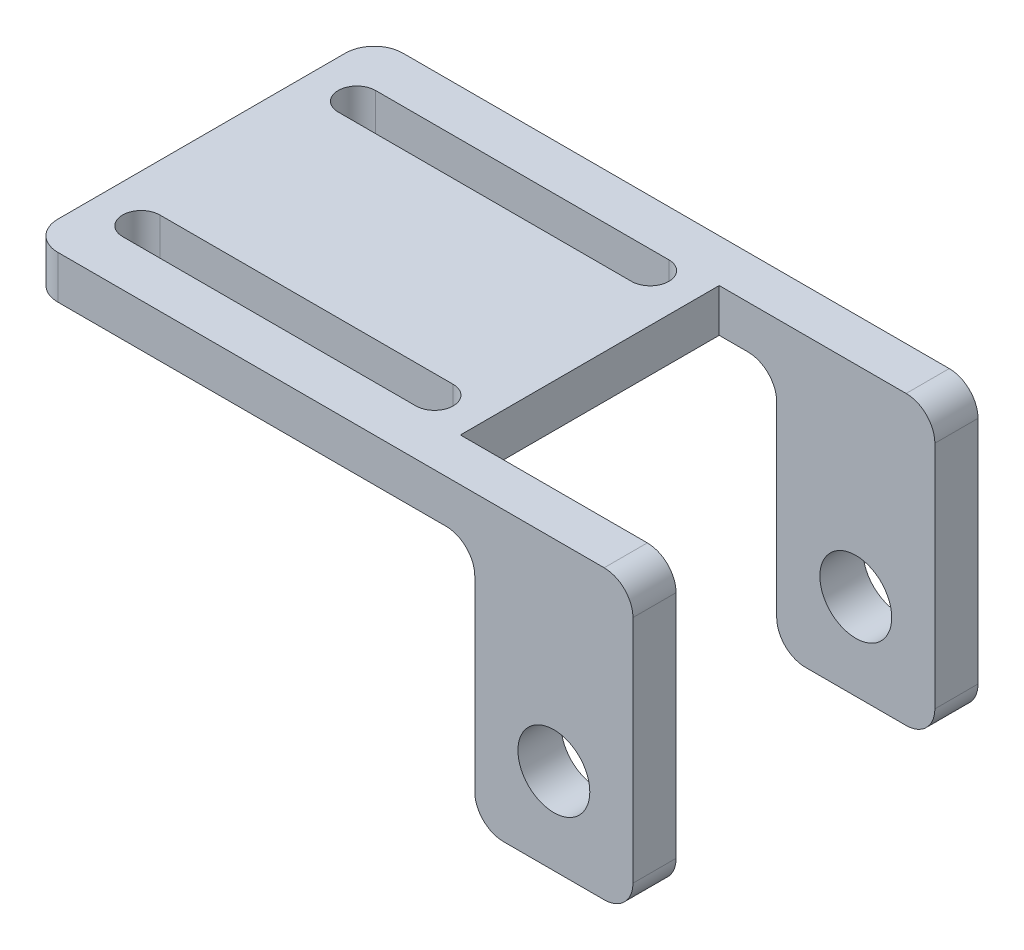
ISO-10303-21;
HEADER;
FILE_DESCRIPTION(('STEP AP214'),'2;1');
FILE_NAME('part.step','',(''),(''),'','','');
FILE_SCHEMA(('AUTOMOTIVE_DESIGN { 1 0 10303 214 1 1 1 1 }'));
ENDSEC;
DATA;
#1=APPLICATION_CONTEXT('core data for automotive mechanical design processes');
#2=APPLICATION_PROTOCOL_DEFINITION('international standard','automotive_design',2000,#1);
#3=PRODUCT_CONTEXT('',#1,'mechanical');
#4=PRODUCT('Part','Part','',(#3));
#5=PRODUCT_RELATED_PRODUCT_CATEGORY('part','',(#4));
#6=PRODUCT_DEFINITION_FORMATION('','',#4);
#7=PRODUCT_DEFINITION_CONTEXT('part definition',#1,'design');
#8=PRODUCT_DEFINITION('design','',#6,#7);
#9=PRODUCT_DEFINITION_SHAPE('','',#8);
#10=(LENGTH_UNIT() NAMED_UNIT(*) SI_UNIT(.MILLI.,.METRE.));
#11=(NAMED_UNIT(*) PLANE_ANGLE_UNIT() SI_UNIT($,.RADIAN.));
#12=(NAMED_UNIT(*) SI_UNIT($,.STERADIAN.) SOLID_ANGLE_UNIT());
#13=UNCERTAINTY_MEASURE_WITH_UNIT(LENGTH_MEASURE(1.E-05),#10,'distance_accuracy_value','');
#14=(GEOMETRIC_REPRESENTATION_CONTEXT(3) GLOBAL_UNCERTAINTY_ASSIGNED_CONTEXT((#13)) GLOBAL_UNIT_ASSIGNED_CONTEXT((#10,
#11,#12)) REPRESENTATION_CONTEXT('',''));
#15=CARTESIAN_POINT('',(0.,0.,0.));
#16=DIRECTION('',(0.,0.,1.));
#17=DIRECTION('',(1.,0.,0.));
#18=AXIS2_PLACEMENT_3D('',#15,#16,#17);
#19=CARTESIAN_POINT('',(42.,3.,0.));
#20=DIRECTION('',(-1.,0.,0.));
#21=DIRECTION('',(0.,0.,1.));
#22=AXIS2_PLACEMENT_3D('',#19,#20,#21);
#23=PLANE('',#22);
#24=DIRECTION('',(0.,1.,0.));
#25=VECTOR('',#24,1.);
#26=CARTESIAN_POINT('',(42.,-17.,-3.));
#27=LINE('',#26,#25);
#28=CARTESIAN_POINT('',(42.,-15.,-3.));
#29=VERTEX_POINT('',#28);
#30=CARTESIAN_POINT('',(42.,1.,-3.));
#31=VERTEX_POINT('',#30);
#32=EDGE_CURVE('E350',#29,#31,#27,.T.);
#33=ORIENTED_EDGE('',*,*,#32,.T.);
#34=DIRECTION('',(0.,0.,-1.));
#35=VECTOR('',#34,1.);
#36=CARTESIAN_POINT('',(42.,1.,0.));
#37=LINE('',#36,#35);
#38=CARTESIAN_POINT('',(42.,1.,0.));
#39=VERTEX_POINT('',#38);
#40=EDGE_CURVE('E433',#31,#39,#37,.F.);
#41=ORIENTED_EDGE('',*,*,#40,.T.);
#42=DIRECTION('',(0.,-1.,0.));
#43=VECTOR('',#42,1.);
#44=CARTESIAN_POINT('',(42.,3.,0.));
#45=LINE('',#44,#43);
#46=CARTESIAN_POINT('',(42.,-15.,0.));
#47=VERTEX_POINT('',#46);
#48=EDGE_CURVE('E378',#39,#47,#45,.T.);
#49=ORIENTED_EDGE('',*,*,#48,.T.);
#50=DIRECTION('',(0.,0.,1.));
#51=VECTOR('',#50,1.);
#52=CARTESIAN_POINT('',(42.,-15.,0.));
#53=LINE('',#52,#51);
#54=EDGE_CURVE('E431',#47,#29,#53,.F.);
#55=ORIENTED_EDGE('',*,*,#54,.T.);
#56=EDGE_LOOP('',(#33,#41,#49,#55));
#57=FACE_BOUND('',#56,.T.);
#58=ADVANCED_FACE('F38',(#57),#23,.F.);
#59=CARTESIAN_POINT('',(0.,0.,0.));
#60=DIRECTION('',(0.,-1.,0.));
#61=DIRECTION('',(0.,0.,-1.));
#62=AXIS2_PLACEMENT_3D('',#59,#60,#61);
#63=PLANE('',#62);
#64=CARTESIAN_POINT('',(3.29999999999999,0.,-19.5));
#65=DIRECTION('',(0.,-1.,0.));
#66=DIRECTION('',(0.,0.,-1.));
#67=AXIS2_PLACEMENT_3D('',#64,#65,#66);
#68=CIRCLE('',#67,1.3);
#69=CARTESIAN_POINT('',(3.29999999999999,0.,-18.2));
#70=VERTEX_POINT('',#69);
#71=CARTESIAN_POINT('',(3.29999999999999,0.,-20.8));
#72=VERTEX_POINT('',#71);
#73=EDGE_CURVE('E296',#70,#72,#68,.T.);
#74=ORIENTED_EDGE('',*,*,#73,.F.);
#75=DIRECTION('',(-1.,0.,0.));
#76=VECTOR('',#75,1.);
#77=CARTESIAN_POINT('',(0.,0.,-18.2));
#78=LINE('',#77,#76);
#79=CARTESIAN_POINT('',(23.7,0.,-18.2));
#80=VERTEX_POINT('',#79);
#81=EDGE_CURVE('E291',#80,#70,#78,.T.);
#82=ORIENTED_EDGE('',*,*,#81,.F.);
#83=CARTESIAN_POINT('',(23.7,0.,-19.5));
#84=DIRECTION('',(0.,-1.,0.));
#85=DIRECTION('',(0.,0.,-1.));
#86=AXIS2_PLACEMENT_3D('',#83,#84,#85);
#87=CIRCLE('',#86,1.29999999999999);
#88=CARTESIAN_POINT('',(23.7,0.,-20.8));
#89=VERTEX_POINT('',#88);
#90=EDGE_CURVE('E239',#89,#80,#87,.T.);
#91=ORIENTED_EDGE('',*,*,#90,.F.);
#92=DIRECTION('',(1.,0.,0.));
#93=VECTOR('',#92,1.);
#94=CARTESIAN_POINT('',(0.,0.,-20.8));
#95=LINE('',#94,#93);
#96=EDGE_CURVE('E294',#72,#89,#95,.T.);
#97=ORIENTED_EDGE('',*,*,#96,.F.);
#98=EDGE_LOOP('',(#74,#82,#91,#97));
#99=FACE_BOUND('',#98,.T.);
#100=CARTESIAN_POINT('',(3.3,0.,-4.5));
#101=DIRECTION('',(0.,-1.,0.));
#102=DIRECTION('',(0.,0.,-1.));
#103=AXIS2_PLACEMENT_3D('',#100,#101,#102);
#104=CIRCLE('',#103,1.3);
#105=CARTESIAN_POINT('',(3.3,0.,-3.2));
#106=VERTEX_POINT('',#105);
#107=CARTESIAN_POINT('',(3.3,0.,-5.8));
#108=VERTEX_POINT('',#107);
#109=EDGE_CURVE('E289',#106,#108,#104,.T.);
#110=ORIENTED_EDGE('',*,*,#109,.F.);
#111=DIRECTION('',(-1.,0.,0.));
#112=VECTOR('',#111,1.);
#113=CARTESIAN_POINT('',(0.,0.,-3.2));
#114=LINE('',#113,#112);
#115=CARTESIAN_POINT('',(23.7,0.,-3.2));
#116=VERTEX_POINT('',#115);
#117=EDGE_CURVE('E263',#116,#106,#114,.T.);
#118=ORIENTED_EDGE('',*,*,#117,.F.);
#119=CARTESIAN_POINT('',(23.7,0.,-4.5));
#120=DIRECTION('',(0.,-1.,0.));
#121=DIRECTION('',(0.,0.,-1.));
#122=AXIS2_PLACEMENT_3D('',#119,#120,#121);
#123=CIRCLE('',#122,1.3);
#124=CARTESIAN_POINT('',(23.7,0.,-5.8));
#125=VERTEX_POINT('',#124);
#126=EDGE_CURVE('E285',#125,#116,#123,.T.);
#127=ORIENTED_EDGE('',*,*,#126,.F.);
#128=DIRECTION('',(1.,0.,0.));
#129=VECTOR('',#128,1.);
#130=CARTESIAN_POINT('',(0.,0.,-5.8));
#131=LINE('',#130,#129);
#132=EDGE_CURVE('E287',#108,#125,#131,.T.);
#133=ORIENTED_EDGE('',*,*,#132,.F.);
#134=EDGE_LOOP('',(#110,#118,#127,#133));
#135=FACE_BOUND('',#134,.T.);
#136=DIRECTION('',(1.,0.,0.));
#137=VECTOR('',#136,1.);
#138=CARTESIAN_POINT('',(42.,0.,-3.));
#139=LINE('',#138,#137);
#140=CARTESIAN_POINT('',(27.,0.,-3.));
#141=VERTEX_POINT('',#140);
#142=CARTESIAN_POINT('',(29.,0.,-3.));
#143=VERTEX_POINT('',#142);
#144=EDGE_CURVE('E305',#141,#143,#139,.T.);
#145=ORIENTED_EDGE('',*,*,#144,.T.);
#146=DIRECTION('',(0.,0.,-1.));
#147=VECTOR('',#146,1.);
#148=CARTESIAN_POINT('',(29.,0.,0.));
#149=LINE('',#148,#147);
#150=CARTESIAN_POINT('',(29.,0.,0.));
#151=VERTEX_POINT('',#150);
#152=EDGE_CURVE('E462',#143,#151,#149,.F.);
#153=ORIENTED_EDGE('',*,*,#152,.T.);
#154=DIRECTION('',(1.,0.,0.));
#155=VECTOR('',#154,1.);
#156=CARTESIAN_POINT('',(0.,0.,0.));
#157=LINE('',#156,#155);
#158=CARTESIAN_POINT('',(2.,0.,0.));
#159=VERTEX_POINT('',#158);
#160=EDGE_CURVE('E372',#159,#151,#157,.T.);
#161=ORIENTED_EDGE('',*,*,#160,.F.);
#162=CARTESIAN_POINT('',(2.,0.,-2.));
#163=DIRECTION('',(0.,-1.,0.));
#164=DIRECTION('',(0.,0.,-1.));
#165=AXIS2_PLACEMENT_3D('',#162,#163,#164);
#166=CIRCLE('',#165,2.);
#167=CARTESIAN_POINT('',(0.,0.,-2.));
#168=VERTEX_POINT('',#167);
#169=EDGE_CURVE('E388',#159,#168,#166,.T.);
#170=ORIENTED_EDGE('',*,*,#169,.T.);
#171=DIRECTION('',(0.,0.,1.));
#172=VECTOR('',#171,1.);
#173=CARTESIAN_POINT('',(0.,0.,0.));
#174=LINE('',#173,#172);
#175=CARTESIAN_POINT('',(0.,0.,-22.));
#176=VERTEX_POINT('',#175);
#177=EDGE_CURVE('E359',#176,#168,#174,.T.);
#178=ORIENTED_EDGE('',*,*,#177,.F.);
#179=CARTESIAN_POINT('',(1.99999999999999,0.,-22.));
#180=DIRECTION('',(0.,-1.,0.));
#181=DIRECTION('',(0.,0.,-1.));
#182=AXIS2_PLACEMENT_3D('',#179,#180,#181);
#183=CIRCLE('',#182,2.);
#184=CARTESIAN_POINT('',(1.99999999999999,0.,-24.));
#185=VERTEX_POINT('',#184);
#186=EDGE_CURVE('E390',#176,#185,#183,.T.);
#187=ORIENTED_EDGE('',*,*,#186,.T.);
#188=DIRECTION('',(-1.,0.,0.));
#189=VECTOR('',#188,1.);
#190=CARTESIAN_POINT('',(0.,0.,-24.));
#191=LINE('',#190,#189);
#192=CARTESIAN_POINT('',(29.,0.,-24.));
#193=VERTEX_POINT('',#192);
#194=EDGE_CURVE('E364',#193,#185,#191,.T.);
#195=ORIENTED_EDGE('',*,*,#194,.F.);
#196=DIRECTION('',(0.,0.,-1.));
#197=VECTOR('',#196,1.);
#198=CARTESIAN_POINT('',(29.,0.,0.));
#199=LINE('',#198,#197);
#200=CARTESIAN_POINT('',(29.,0.,-21.));
#201=VERTEX_POINT('',#200);
#202=EDGE_CURVE('E460',#193,#201,#199,.F.);
#203=ORIENTED_EDGE('',*,*,#202,.T.);
#204=DIRECTION('',(-1.,0.,0.));
#205=VECTOR('',#204,1.);
#206=CARTESIAN_POINT('',(42.,0.,-21.));
#207=LINE('',#206,#205);
#208=CARTESIAN_POINT('',(27.,0.,-21.));
#209=VERTEX_POINT('',#208);
#210=EDGE_CURVE('E299',#201,#209,#207,.T.);
#211=ORIENTED_EDGE('',*,*,#210,.T.);
#212=DIRECTION('',(0.,0.,1.));
#213=VECTOR('',#212,1.);
#214=CARTESIAN_POINT('',(27.,0.,-21.));
#215=LINE('',#214,#213);
#216=EDGE_CURVE('E301',#209,#141,#215,.T.);
#217=ORIENTED_EDGE('',*,*,#216,.T.);
#218=EDGE_LOOP('',(#145,#153,#161,#170,#178,#187,#195,#203,#211,#217));
#219=FACE_BOUND('',#218,.T.);
#220=ADVANCED_FACE('F479',(#99,#135,#219),#63,.T.);
#221=CARTESIAN_POINT('',(0.,3.,0.));
#222=DIRECTION('',(1.,0.,0.));
#223=DIRECTION('',(0.,0.,-1.));
#224=AXIS2_PLACEMENT_3D('',#221,#222,#223);
#225=PLANE('',#224);
#226=DIRECTION('',(0.,0.,1.));
#227=VECTOR('',#226,1.);
#228=CARTESIAN_POINT('',(0.,3.,0.));
#229=LINE('',#228,#227);
#230=CARTESIAN_POINT('',(0.,3.,-22.));
#231=VERTEX_POINT('',#230);
#232=CARTESIAN_POINT('',(0.,3.,-2.));
#233=VERTEX_POINT('',#232);
#234=EDGE_CURVE('E360',#231,#233,#229,.T.);
#235=ORIENTED_EDGE('',*,*,#234,.F.);
#236=DIRECTION('',(0.,-1.,0.));
#237=VECTOR('',#236,1.);
#238=CARTESIAN_POINT('',(0.,3.,-22.));
#239=LINE('',#238,#237);
#240=EDGE_CURVE('E385',#231,#176,#239,.T.);
#241=ORIENTED_EDGE('',*,*,#240,.T.);
#242=ORIENTED_EDGE('',*,*,#177,.T.);
#243=DIRECTION('',(0.,-1.,0.));
#244=VECTOR('',#243,1.);
#245=CARTESIAN_POINT('',(0.,3.,-2.));
#246=LINE('',#245,#244);
#247=EDGE_CURVE('E381',#168,#233,#246,.F.);
#248=ORIENTED_EDGE('',*,*,#247,.T.);
#249=EDGE_LOOP('',(#235,#241,#242,#248));
#250=FACE_BOUND('',#249,.T.);
#251=ADVANCED_FACE('F564',(#250),#225,.F.);
#252=CARTESIAN_POINT('',(0.,3.,0.));
#253=DIRECTION('',(0.,0.,-1.));
#254=DIRECTION('',(-1.,0.,0.));
#255=AXIS2_PLACEMENT_3D('',#252,#253,#254);
#256=PLANE('',#255);
#257=CARTESIAN_POINT('',(36.5,-11.,0.));
#258=DIRECTION('',(0.,0.,1.));
#259=DIRECTION('',(1.,0.,0.));
#260=AXIS2_PLACEMENT_3D('',#257,#258,#259);
#261=CIRCLE('',#260,2.5);
#262=CARTESIAN_POINT('',(39.,-11.,0.));
#263=VERTEX_POINT('',#262);
#264=EDGE_CURVE('E317',#263,#263,#261,.T.);
#265=ORIENTED_EDGE('',*,*,#264,.F.);
#266=EDGE_LOOP('',(#265));
#267=FACE_BOUND('',#266,.T.);
#268=ORIENTED_EDGE('',*,*,#48,.F.);
#269=CARTESIAN_POINT('',(40.,1.,0.));
#270=DIRECTION('',(0.,0.,-1.));
#271=DIRECTION('',(-1.,0.,0.));
#272=AXIS2_PLACEMENT_3D('',#269,#270,#271);
#273=CIRCLE('',#272,2.);
#274=CARTESIAN_POINT('',(40.,3.,0.));
#275=VERTEX_POINT('',#274);
#276=EDGE_CURVE('E439',#39,#275,#273,.F.);
#277=ORIENTED_EDGE('',*,*,#276,.T.);
#278=DIRECTION('',(1.,0.,0.));
#279=VECTOR('',#278,1.);
#280=CARTESIAN_POINT('',(0.,3.,0.));
#281=LINE('',#280,#279);
#282=CARTESIAN_POINT('',(2.,3.,0.));
#283=VERTEX_POINT('',#282);
#284=EDGE_CURVE('E363',#283,#275,#281,.T.);
#285=ORIENTED_EDGE('',*,*,#284,.F.);
#286=DIRECTION('',(0.,-1.,0.));
#287=VECTOR('',#286,1.);
#288=CARTESIAN_POINT('',(2.,3.,0.));
#289=LINE('',#288,#287);
#290=EDGE_CURVE('E400',#283,#159,#289,.T.);
#291=ORIENTED_EDGE('',*,*,#290,.T.);
#292=ORIENTED_EDGE('',*,*,#160,.T.);
#293=CARTESIAN_POINT('',(29.,-2.,0.));
#294=DIRECTION('',(0.,0.,-1.));
#295=DIRECTION('',(-1.,0.,0.));
#296=AXIS2_PLACEMENT_3D('',#293,#294,#295);
#297=CIRCLE('',#296,2.);
#298=CARTESIAN_POINT('',(31.,-2.,0.));
#299=VERTEX_POINT('',#298);
#300=EDGE_CURVE('E469',#151,#299,#297,.T.);
#301=ORIENTED_EDGE('',*,*,#300,.T.);
#302=DIRECTION('',(0.,1.,0.));
#303=VECTOR('',#302,1.);
#304=CARTESIAN_POINT('',(31.,-17.,0.));
#305=LINE('',#304,#303);
#306=CARTESIAN_POINT('',(31.,-15.,0.));
#307=VERTEX_POINT('',#306);
#308=EDGE_CURVE('E356',#307,#299,#305,.T.);
#309=ORIENTED_EDGE('',*,*,#308,.F.);
#310=CARTESIAN_POINT('',(33.,-15.,0.));
#311=DIRECTION('',(0.,0.,-1.));
#312=DIRECTION('',(-1.,0.,0.));
#313=AXIS2_PLACEMENT_3D('',#310,#311,#312);
#314=CIRCLE('',#313,2.);
#315=CARTESIAN_POINT('',(33.,-17.,0.));
#316=VERTEX_POINT('',#315);
#317=EDGE_CURVE('E435',#307,#316,#314,.F.);
#318=ORIENTED_EDGE('',*,*,#317,.T.);
#319=DIRECTION('',(-1.,0.,0.));
#320=VECTOR('',#319,1.);
#321=CARTESIAN_POINT('',(42.,-17.,0.));
#322=LINE('',#321,#320);
#323=CARTESIAN_POINT('',(40.,-17.,0.));
#324=VERTEX_POINT('',#323);
#325=EDGE_CURVE('E344',#324,#316,#322,.T.);
#326=ORIENTED_EDGE('',*,*,#325,.F.);
#327=CARTESIAN_POINT('',(40.,-15.,0.));
#328=DIRECTION('',(0.,0.,-1.));
#329=DIRECTION('',(-1.,0.,0.));
#330=AXIS2_PLACEMENT_3D('',#327,#328,#329);
#331=CIRCLE('',#330,2.);
#332=EDGE_CURVE('E437',#324,#47,#331,.F.);
#333=ORIENTED_EDGE('',*,*,#332,.T.);
#334=EDGE_LOOP('',(#268,#277,#285,#291,#292,#301,#309,#318,#326,#333));
#335=FACE_BOUND('',#334,.T.);
#336=ADVANCED_FACE('F531',(#267,#335),#256,.F.);
#337=DIRECTION('',(0.,-1.,0.));
#338=VECTOR('',#337,1.);
#339=CARTESIAN_POINT('',(42.,3.,-24.));
#340=LINE('',#339,#338);
#341=CARTESIAN_POINT('',(42.,1.,-24.));
#342=VERTEX_POINT('',#341);
#343=CARTESIAN_POINT('',(42.,-15.,-24.));
#344=VERTEX_POINT('',#343);
#345=EDGE_CURVE('E369',#342,#344,#340,.T.);
#346=ORIENTED_EDGE('',*,*,#345,.F.);
#347=DIRECTION('',(0.,0.,-1.));
#348=VECTOR('',#347,1.);
#349=CARTESIAN_POINT('',(42.,1.,0.));
#350=LINE('',#349,#348);
#351=CARTESIAN_POINT('',(42.,1.,-21.));
#352=VERTEX_POINT('',#351);
#353=EDGE_CURVE('E417',#342,#352,#350,.F.);
#354=ORIENTED_EDGE('',*,*,#353,.T.);
#355=DIRECTION('',(0.,1.,0.));
#356=VECTOR('',#355,1.);
#357=CARTESIAN_POINT('',(42.,-17.,-21.));
#358=LINE('',#357,#356);
#359=CARTESIAN_POINT('',(42.,-15.,-21.));
#360=VERTEX_POINT('',#359);
#361=EDGE_CURVE('E341',#360,#352,#358,.T.);
#362=ORIENTED_EDGE('',*,*,#361,.F.);
#363=DIRECTION('',(0.,0.,1.));
#364=VECTOR('',#363,1.);
#365=CARTESIAN_POINT('',(42.,-15.,-24.));
#366=LINE('',#365,#364);
#367=EDGE_CURVE('E415',#360,#344,#366,.F.);
#368=ORIENTED_EDGE('',*,*,#367,.T.);
#369=EDGE_LOOP('',(#346,#354,#362,#368));
#370=FACE_BOUND('',#369,.T.);
#371=ADVANCED_FACE('F508',(#370),#23,.F.);
#372=CARTESIAN_POINT('',(0.,3.,-24.));
#373=DIRECTION('',(0.,0.,1.));
#374=DIRECTION('',(1.,0.,0.));
#375=AXIS2_PLACEMENT_3D('',#372,#373,#374);
#376=PLANE('',#375);
#377=CARTESIAN_POINT('',(36.5,-11.,-24.));
#378=DIRECTION('',(0.,0.,1.));
#379=DIRECTION('',(1.,0.,0.));
#380=AXIS2_PLACEMENT_3D('',#377,#378,#379);
#381=CIRCLE('',#380,2.5);
#382=CARTESIAN_POINT('',(39.,-11.,-24.));
#383=VERTEX_POINT('',#382);
#384=EDGE_CURVE('E320',#383,#383,#381,.T.);
#385=ORIENTED_EDGE('',*,*,#384,.T.);
#386=EDGE_LOOP('',(#385));
#387=FACE_BOUND('',#386,.T.);
#388=DIRECTION('',(-1.,0.,0.));
#389=VECTOR('',#388,1.);
#390=CARTESIAN_POINT('',(0.,3.,-24.));
#391=LINE('',#390,#389);
#392=CARTESIAN_POINT('',(40.,3.,-24.));
#393=VERTEX_POINT('',#392);
#394=CARTESIAN_POINT('',(1.99999999999999,3.,-24.));
#395=VERTEX_POINT('',#394);
#396=EDGE_CURVE('E367',#393,#395,#391,.T.);
#397=ORIENTED_EDGE('',*,*,#396,.F.);
#398=CARTESIAN_POINT('',(40.,1.,-24.));
#399=DIRECTION('',(0.,0.,1.));
#400=DIRECTION('',(1.,0.,0.));
#401=AXIS2_PLACEMENT_3D('',#398,#399,#400);
#402=CIRCLE('',#401,2.);
#403=EDGE_CURVE('E413',#393,#342,#402,.F.);
#404=ORIENTED_EDGE('',*,*,#403,.T.);
#405=ORIENTED_EDGE('',*,*,#345,.T.);
#406=CARTESIAN_POINT('',(40.,-15.,-24.));
#407=DIRECTION('',(0.,0.,1.));
#408=DIRECTION('',(1.,0.,0.));
#409=AXIS2_PLACEMENT_3D('',#406,#407,#408);
#410=CIRCLE('',#409,2.);
#411=CARTESIAN_POINT('',(40.,-17.,-24.));
#412=VERTEX_POINT('',#411);
#413=EDGE_CURVE('E411',#344,#412,#410,.F.);
#414=ORIENTED_EDGE('',*,*,#413,.T.);
#415=DIRECTION('',(1.,0.,0.));
#416=VECTOR('',#415,1.);
#417=CARTESIAN_POINT('',(42.,-17.,-24.));
#418=LINE('',#417,#416);
#419=CARTESIAN_POINT('',(33.,-17.,-24.));
#420=VERTEX_POINT('',#419);
#421=EDGE_CURVE('E332',#420,#412,#418,.T.);
#422=ORIENTED_EDGE('',*,*,#421,.F.);
#423=CARTESIAN_POINT('',(33.,-15.,-24.));
#424=DIRECTION('',(0.,0.,1.));
#425=DIRECTION('',(1.,0.,0.));
#426=AXIS2_PLACEMENT_3D('',#423,#424,#425);
#427=CIRCLE('',#426,2.);
#428=CARTESIAN_POINT('',(31.,-15.,-24.));
#429=VERTEX_POINT('',#428);
#430=EDGE_CURVE('E409',#420,#429,#427,.F.);
#431=ORIENTED_EDGE('',*,*,#430,.T.);
#432=DIRECTION('',(0.,1.,0.));
#433=VECTOR('',#432,1.);
#434=CARTESIAN_POINT('',(31.,-17.,-24.));
#435=LINE('',#434,#433);
#436=CARTESIAN_POINT('',(31.,-2.,-24.));
#437=VERTEX_POINT('',#436);
#438=EDGE_CURVE('E335',#429,#437,#435,.T.);
#439=ORIENTED_EDGE('',*,*,#438,.T.);
#440=CARTESIAN_POINT('',(29.,-2.,-24.));
#441=DIRECTION('',(0.,0.,1.));
#442=DIRECTION('',(1.,0.,0.));
#443=AXIS2_PLACEMENT_3D('',#440,#441,#442);
#444=CIRCLE('',#443,2.);
#445=EDGE_CURVE('E46',#437,#193,#444,.T.);
#446=ORIENTED_EDGE('',*,*,#445,.T.);
#447=ORIENTED_EDGE('',*,*,#194,.T.);
#448=DIRECTION('',(0.,-1.,0.));
#449=VECTOR('',#448,1.);
#450=CARTESIAN_POINT('',(1.99999999999999,3.,-24.));
#451=LINE('',#450,#449);
#452=EDGE_CURVE('E393',#185,#395,#451,.F.);
#453=ORIENTED_EDGE('',*,*,#452,.T.);
#454=EDGE_LOOP('',(#397,#404,#405,#414,#422,#431,#439,#446,#447,#453));
#455=FACE_BOUND('',#454,.T.);
#456=ADVANCED_FACE('F473',(#387,#455),#376,.F.);
#457=CARTESIAN_POINT('',(0.,3.,0.));
#458=DIRECTION('',(0.,-1.,0.));
#459=DIRECTION('',(0.,0.,-1.));
#460=AXIS2_PLACEMENT_3D('',#457,#458,#459);
#461=PLANE('',#460);
#462=DIRECTION('',(1.,0.,0.));
#463=VECTOR('',#462,1.);
#464=CARTESIAN_POINT('',(3.29999999999999,3.,-18.2));
#465=LINE('',#464,#463);
#466=CARTESIAN_POINT('',(3.29999999999999,3.,-18.2));
#467=VERTEX_POINT('',#466);
#468=CARTESIAN_POINT('',(23.7,3.,-18.2));
#469=VERTEX_POINT('',#468);
#470=EDGE_CURVE('E246',#467,#469,#465,.T.);
#471=ORIENTED_EDGE('',*,*,#470,.F.);
#472=CARTESIAN_POINT('',(3.29999999999999,3.,-19.5));
#473=DIRECTION('',(0.,1.,0.));
#474=DIRECTION('',(0.,0.,1.));
#475=AXIS2_PLACEMENT_3D('',#472,#473,#474);
#476=CIRCLE('',#475,1.3);
#477=CARTESIAN_POINT('',(3.29999999999999,3.,-20.8));
#478=VERTEX_POINT('',#477);
#479=EDGE_CURVE('E251',#478,#467,#476,.T.);
#480=ORIENTED_EDGE('',*,*,#479,.F.);
#481=DIRECTION('',(-1.,0.,0.));
#482=VECTOR('',#481,1.);
#483=CARTESIAN_POINT('',(3.29999999999999,3.,-20.8));
#484=LINE('',#483,#482);
#485=CARTESIAN_POINT('',(23.7,3.,-20.8));
#486=VERTEX_POINT('',#485);
#487=EDGE_CURVE('E256',#486,#478,#484,.T.);
#488=ORIENTED_EDGE('',*,*,#487,.F.);
#489=CARTESIAN_POINT('',(23.7,3.,-19.5));
#490=DIRECTION('',(0.,1.,0.));
#491=DIRECTION('',(0.,0.,1.));
#492=AXIS2_PLACEMENT_3D('',#489,#490,#491);
#493=CIRCLE('',#492,1.29999999999999);
#494=EDGE_CURVE('E236',#469,#486,#493,.T.);
#495=ORIENTED_EDGE('',*,*,#494,.F.);
#496=EDGE_LOOP('',(#471,#480,#488,#495));
#497=FACE_BOUND('',#496,.T.);
#498=DIRECTION('',(1.,0.,0.));
#499=VECTOR('',#498,1.);
#500=CARTESIAN_POINT('',(3.3,3.,-3.2));
#501=LINE('',#500,#499);
#502=CARTESIAN_POINT('',(3.3,3.,-3.2));
#503=VERTEX_POINT('',#502);
#504=CARTESIAN_POINT('',(23.7,3.,-3.2));
#505=VERTEX_POINT('',#504);
#506=EDGE_CURVE('E268',#503,#505,#501,.T.);
#507=ORIENTED_EDGE('',*,*,#506,.F.);
#508=CARTESIAN_POINT('',(3.3,3.,-4.5));
#509=DIRECTION('',(0.,1.,0.));
#510=DIRECTION('',(0.,0.,1.));
#511=AXIS2_PLACEMENT_3D('',#508,#509,#510);
#512=CIRCLE('',#511,1.3);
#513=CARTESIAN_POINT('',(3.3,3.,-5.8));
#514=VERTEX_POINT('',#513);
#515=EDGE_CURVE('E266',#514,#503,#512,.T.);
#516=ORIENTED_EDGE('',*,*,#515,.F.);
#517=DIRECTION('',(-1.,0.,0.));
#518=VECTOR('',#517,1.);
#519=CARTESIAN_POINT('',(3.3,3.,-5.8));
#520=LINE('',#519,#518);
#521=CARTESIAN_POINT('',(23.7,3.,-5.8));
#522=VERTEX_POINT('',#521);
#523=EDGE_CURVE('E273',#522,#514,#520,.T.);
#524=ORIENTED_EDGE('',*,*,#523,.F.);
#525=CARTESIAN_POINT('',(23.7,3.,-4.5));
#526=DIRECTION('',(0.,1.,0.));
#527=DIRECTION('',(0.,0.,1.));
#528=AXIS2_PLACEMENT_3D('',#525,#526,#527);
#529=CIRCLE('',#528,1.3);
#530=EDGE_CURVE('E270',#505,#522,#529,.T.);
#531=ORIENTED_EDGE('',*,*,#530,.F.);
#532=EDGE_LOOP('',(#507,#516,#524,#531));
#533=FACE_BOUND('',#532,.T.);
#534=DIRECTION('',(-1.,0.,0.));
#535=VECTOR('',#534,1.);
#536=CARTESIAN_POINT('',(42.,3.,-21.));
#537=LINE('',#536,#535);
#538=CARTESIAN_POINT('',(40.,3.,-21.));
#539=VERTEX_POINT('',#538);
#540=CARTESIAN_POINT('',(27.,3.,-21.));
#541=VERTEX_POINT('',#540);
#542=EDGE_CURVE('E298',#539,#541,#537,.T.);
#543=ORIENTED_EDGE('',*,*,#542,.F.);
#544=DIRECTION('',(0.,0.,-1.));
#545=VECTOR('',#544,1.);
#546=CARTESIAN_POINT('',(40.,3.,0.));
#547=LINE('',#546,#545);
#548=EDGE_CURVE('E406',#539,#393,#547,.T.);
#549=ORIENTED_EDGE('',*,*,#548,.T.);
#550=ORIENTED_EDGE('',*,*,#396,.T.);
#551=CARTESIAN_POINT('',(1.99999999999999,3.,-22.));
#552=DIRECTION('',(0.,-1.,0.));
#553=DIRECTION('',(0.,0.,-1.));
#554=AXIS2_PLACEMENT_3D('',#551,#552,#553);
#555=CIRCLE('',#554,2.);
#556=EDGE_CURVE('E398',#395,#231,#555,.F.);
#557=ORIENTED_EDGE('',*,*,#556,.T.);
#558=ORIENTED_EDGE('',*,*,#234,.T.);
#559=CARTESIAN_POINT('',(2.,3.,-2.));
#560=DIRECTION('',(0.,-1.,0.));
#561=DIRECTION('',(0.,0.,-1.));
#562=AXIS2_PLACEMENT_3D('',#559,#560,#561);
#563=CIRCLE('',#562,2.);
#564=EDGE_CURVE('E396',#233,#283,#563,.F.);
#565=ORIENTED_EDGE('',*,*,#564,.T.);
#566=ORIENTED_EDGE('',*,*,#284,.T.);
#567=DIRECTION('',(0.,0.,-1.));
#568=VECTOR('',#567,1.);
#569=CARTESIAN_POINT('',(40.,3.,0.));
#570=LINE('',#569,#568);
#571=CARTESIAN_POINT('',(40.,3.,-3.));
#572=VERTEX_POINT('',#571);
#573=EDGE_CURVE('E403',#275,#572,#570,.T.);
#574=ORIENTED_EDGE('',*,*,#573,.T.);
#575=DIRECTION('',(1.,0.,0.));
#576=VECTOR('',#575,1.);
#577=CARTESIAN_POINT('',(42.,3.,-3.));
#578=LINE('',#577,#576);
#579=CARTESIAN_POINT('',(27.,3.,-3.));
#580=VERTEX_POINT('',#579);
#581=EDGE_CURVE('E302',#580,#572,#578,.T.);
#582=ORIENTED_EDGE('',*,*,#581,.F.);
#583=DIRECTION('',(0.,0.,1.));
#584=VECTOR('',#583,1.);
#585=CARTESIAN_POINT('',(27.,3.,-21.));
#586=LINE('',#585,#584);
#587=EDGE_CURVE('E310',#541,#580,#586,.T.);
#588=ORIENTED_EDGE('',*,*,#587,.F.);
#589=EDGE_LOOP('',(#543,#549,#550,#557,#558,#565,#566,#574,#582,#588));
#590=FACE_BOUND('',#589,.T.);
#591=ADVANCED_FACE('F253',(#497,#533,#590),#461,.F.);
#592=CARTESIAN_POINT('',(31.,-17.,0.));
#593=DIRECTION('',(1.,0.,0.));
#594=DIRECTION('',(0.,0.,-1.));
#595=AXIS2_PLACEMENT_3D('',#592,#593,#594);
#596=PLANE('',#595);
#597=ORIENTED_EDGE('',*,*,#308,.T.);
#598=DIRECTION('',(0.,0.,-1.));
#599=VECTOR('',#598,1.);
#600=CARTESIAN_POINT('',(31.,-2.,0.));
#601=LINE('',#600,#599);
#602=CARTESIAN_POINT('',(31.,-2.,-3.));
#603=VERTEX_POINT('',#602);
#604=EDGE_CURVE('E457',#299,#603,#601,.T.);
#605=ORIENTED_EDGE('',*,*,#604,.T.);
#606=DIRECTION('',(0.,1.,0.));
#607=VECTOR('',#606,1.);
#608=CARTESIAN_POINT('',(31.,-17.,-3.));
#609=LINE('',#608,#607);
#610=CARTESIAN_POINT('',(31.,-15.,-3.));
#611=VERTEX_POINT('',#610);
#612=EDGE_CURVE('E353',#611,#603,#609,.T.);
#613=ORIENTED_EDGE('',*,*,#612,.F.);
#614=DIRECTION('',(0.,0.,-1.));
#615=VECTOR('',#614,1.);
#616=CARTESIAN_POINT('',(31.,-15.,0.));
#617=LINE('',#616,#615);
#618=EDGE_CURVE('E455',#611,#307,#617,.F.);
#619=ORIENTED_EDGE('',*,*,#618,.T.);
#620=EDGE_LOOP('',(#597,#605,#613,#619));
#621=FACE_BOUND('',#620,.T.);
#622=ADVANCED_FACE('F534',(#621),#596,.F.);
#623=CARTESIAN_POINT('',(42.,-17.,-3.));
#624=DIRECTION('',(0.,0.,1.));
#625=DIRECTION('',(1.,0.,0.));
#626=AXIS2_PLACEMENT_3D('',#623,#624,#625);
#627=PLANE('',#626);
#628=CARTESIAN_POINT('',(36.5,-11.,-3.));
#629=DIRECTION('',(0.,0.,1.));
#630=DIRECTION('',(1.,0.,0.));
#631=AXIS2_PLACEMENT_3D('',#628,#629,#630);
#632=CIRCLE('',#631,2.5);
#633=CARTESIAN_POINT('',(39.,-11.,-3.));
#634=VERTEX_POINT('',#633);
#635=EDGE_CURVE('E326',#634,#634,#632,.T.);
#636=ORIENTED_EDGE('',*,*,#635,.T.);
#637=EDGE_LOOP('',(#636));
#638=FACE_BOUND('',#637,.T.);
#639=ORIENTED_EDGE('',*,*,#581,.T.);
#640=CARTESIAN_POINT('',(40.,1.,-3.));
#641=DIRECTION('',(0.,0.,1.));
#642=DIRECTION('',(1.,0.,0.));
#643=AXIS2_PLACEMENT_3D('',#640,#641,#642);
#644=CIRCLE('',#643,2.);
#645=EDGE_CURVE('E429',#572,#31,#644,.F.);
#646=ORIENTED_EDGE('',*,*,#645,.T.);
#647=ORIENTED_EDGE('',*,*,#32,.F.);
#648=CARTESIAN_POINT('',(40.,-15.,-3.));
#649=DIRECTION('',(0.,0.,1.));
#650=DIRECTION('',(1.,0.,0.));
#651=AXIS2_PLACEMENT_3D('',#648,#649,#650);
#652=CIRCLE('',#651,2.);
#653=CARTESIAN_POINT('',(40.,-17.,-3.));
#654=VERTEX_POINT('',#653);
#655=EDGE_CURVE('E427',#29,#654,#652,.F.);
#656=ORIENTED_EDGE('',*,*,#655,.T.);
#657=DIRECTION('',(1.,0.,0.));
#658=VECTOR('',#657,1.);
#659=CARTESIAN_POINT('',(42.,-17.,-3.));
#660=LINE('',#659,#658);
#661=CARTESIAN_POINT('',(33.,-17.,-3.));
#662=VERTEX_POINT('',#661);
#663=EDGE_CURVE('E347',#662,#654,#660,.T.);
#664=ORIENTED_EDGE('',*,*,#663,.F.);
#665=CARTESIAN_POINT('',(33.,-15.,-3.));
#666=DIRECTION('',(0.,0.,1.));
#667=DIRECTION('',(1.,0.,0.));
#668=AXIS2_PLACEMENT_3D('',#665,#666,#667);
#669=CIRCLE('',#668,2.);
#670=EDGE_CURVE('E425',#662,#611,#669,.F.);
#671=ORIENTED_EDGE('',*,*,#670,.T.);
#672=ORIENTED_EDGE('',*,*,#612,.T.);
#673=CARTESIAN_POINT('',(29.,-2.,-3.));
#674=DIRECTION('',(0.,0.,1.));
#675=DIRECTION('',(1.,0.,0.));
#676=AXIS2_PLACEMENT_3D('',#673,#674,#675);
#677=CIRCLE('',#676,2.);
#678=EDGE_CURVE('E467',#603,#143,#677,.T.);
#679=ORIENTED_EDGE('',*,*,#678,.T.);
#680=ORIENTED_EDGE('',*,*,#144,.F.);
#681=DIRECTION('',(0.,1.,0.));
#682=VECTOR('',#681,1.);
#683=CARTESIAN_POINT('',(27.,0.,-3.));
#684=LINE('',#683,#682);
#685=EDGE_CURVE('E315',#141,#580,#684,.T.);
#686=ORIENTED_EDGE('',*,*,#685,.T.);
#687=EDGE_LOOP('',(#639,#646,#647,#656,#664,#671,#672,#679,#680,#686));
#688=FACE_BOUND('',#687,.T.);
#689=ADVANCED_FACE('F606',(#638,#688),#627,.F.);
#690=CARTESIAN_POINT('',(0.,-17.,0.));
#691=DIRECTION('',(0.,1.,0.));
#692=DIRECTION('',(0.,0.,1.));
#693=AXIS2_PLACEMENT_3D('',#690,#691,#692);
#694=PLANE('',#693);
#695=ORIENTED_EDGE('',*,*,#663,.T.);
#696=DIRECTION('',(0.,0.,1.));
#697=VECTOR('',#696,1.);
#698=CARTESIAN_POINT('',(40.,-17.,0.));
#699=LINE('',#698,#697);
#700=EDGE_CURVE('E450',#654,#324,#699,.T.);
#701=ORIENTED_EDGE('',*,*,#700,.T.);
#702=ORIENTED_EDGE('',*,*,#325,.T.);
#703=DIRECTION('',(0.,0.,-1.));
#704=VECTOR('',#703,1.);
#705=CARTESIAN_POINT('',(33.,-17.,0.));
#706=LINE('',#705,#704);
#707=EDGE_CURVE('E447',#316,#662,#706,.T.);
#708=ORIENTED_EDGE('',*,*,#707,.T.);
#709=EDGE_LOOP('',(#695,#701,#702,#708));
#710=FACE_BOUND('',#709,.T.);
#711=ADVANCED_FACE('F542',(#710),#694,.F.);
#712=CARTESIAN_POINT('',(42.,-17.,-21.));
#713=DIRECTION('',(0.,0.,-1.));
#714=DIRECTION('',(-1.,0.,0.));
#715=AXIS2_PLACEMENT_3D('',#712,#713,#714);
#716=PLANE('',#715);
#717=CARTESIAN_POINT('',(36.5,-11.,-21.));
#718=DIRECTION('',(0.,0.,-1.));
#719=DIRECTION('',(-1.,0.,0.));
#720=AXIS2_PLACEMENT_3D('',#717,#718,#719);
#721=CIRCLE('',#720,2.5);
#722=CARTESIAN_POINT('',(34.,-11.,-21.));
#723=VERTEX_POINT('',#722);
#724=EDGE_CURVE('E323',#723,#723,#721,.T.);
#725=ORIENTED_EDGE('',*,*,#724,.T.);
#726=EDGE_LOOP('',(#725));
#727=FACE_BOUND('',#726,.T.);
#728=ORIENTED_EDGE('',*,*,#361,.T.);
#729=CARTESIAN_POINT('',(40.,1.,-21.));
#730=DIRECTION('',(0.,0.,-1.));
#731=DIRECTION('',(-1.,0.,0.));
#732=AXIS2_PLACEMENT_3D('',#729,#730,#731);
#733=CIRCLE('',#732,2.);
#734=EDGE_CURVE('E423',#352,#539,#733,.F.);
#735=ORIENTED_EDGE('',*,*,#734,.T.);
#736=ORIENTED_EDGE('',*,*,#542,.T.);
#737=DIRECTION('',(0.,1.,0.));
#738=VECTOR('',#737,1.);
#739=CARTESIAN_POINT('',(27.,0.,-21.));
#740=LINE('',#739,#738);
#741=EDGE_CURVE('E308',#209,#541,#740,.T.);
#742=ORIENTED_EDGE('',*,*,#741,.F.);
#743=ORIENTED_EDGE('',*,*,#210,.F.);
#744=CARTESIAN_POINT('',(29.,-2.,-21.));
#745=DIRECTION('',(0.,0.,-1.));
#746=DIRECTION('',(-1.,0.,0.));
#747=AXIS2_PLACEMENT_3D('',#744,#745,#746);
#748=CIRCLE('',#747,2.);
#749=CARTESIAN_POINT('',(31.,-2.,-21.));
#750=VERTEX_POINT('',#749);
#751=EDGE_CURVE('E11',#201,#750,#748,.T.);
#752=ORIENTED_EDGE('',*,*,#751,.T.);
#753=DIRECTION('',(0.,1.,0.));
#754=VECTOR('',#753,1.);
#755=CARTESIAN_POINT('',(31.,-17.,-21.));
#756=LINE('',#755,#754);
#757=CARTESIAN_POINT('',(31.,-15.,-21.));
#758=VERTEX_POINT('',#757);
#759=EDGE_CURVE('E338',#758,#750,#756,.T.);
#760=ORIENTED_EDGE('',*,*,#759,.F.);
#761=CARTESIAN_POINT('',(33.,-15.,-21.));
#762=DIRECTION('',(0.,0.,-1.));
#763=DIRECTION('',(-1.,0.,0.));
#764=AXIS2_PLACEMENT_3D('',#761,#762,#763);
#765=CIRCLE('',#764,2.);
#766=CARTESIAN_POINT('',(33.,-17.,-21.));
#767=VERTEX_POINT('',#766);
#768=EDGE_CURVE('E419',#758,#767,#765,.F.);
#769=ORIENTED_EDGE('',*,*,#768,.T.);
#770=DIRECTION('',(-1.,0.,0.));
#771=VECTOR('',#770,1.);
#772=CARTESIAN_POINT('',(42.,-17.,-21.));
#773=LINE('',#772,#771);
#774=CARTESIAN_POINT('',(40.,-17.,-21.));
#775=VERTEX_POINT('',#774);
#776=EDGE_CURVE('E329',#775,#767,#773,.T.);
#777=ORIENTED_EDGE('',*,*,#776,.F.);
#778=CARTESIAN_POINT('',(40.,-15.,-21.));
#779=DIRECTION('',(0.,0.,-1.));
#780=DIRECTION('',(-1.,0.,0.));
#781=AXIS2_PLACEMENT_3D('',#778,#779,#780);
#782=CIRCLE('',#781,2.);
#783=EDGE_CURVE('E421',#775,#360,#782,.F.);
#784=ORIENTED_EDGE('',*,*,#783,.T.);
#785=EDGE_LOOP('',(#728,#735,#736,#742,#743,#752,#760,#769,#777,#784));
#786=FACE_BOUND('',#785,.T.);
#787=ADVANCED_FACE('F486',(#727,#786),#716,.F.);
#788=CARTESIAN_POINT('',(31.,-17.,-24.));
#789=DIRECTION('',(1.,0.,0.));
#790=DIRECTION('',(0.,0.,-1.));
#791=AXIS2_PLACEMENT_3D('',#788,#789,#790);
#792=PLANE('',#791);
#793=ORIENTED_EDGE('',*,*,#759,.T.);
#794=DIRECTION('',(0.,0.,-1.));
#795=VECTOR('',#794,1.);
#796=CARTESIAN_POINT('',(31.,-2.,-24.));
#797=LINE('',#796,#795);
#798=EDGE_CURVE('E464',#750,#437,#797,.T.);
#799=ORIENTED_EDGE('',*,*,#798,.T.);
#800=ORIENTED_EDGE('',*,*,#438,.F.);
#801=DIRECTION('',(0.,0.,-1.));
#802=VECTOR('',#801,1.);
#803=CARTESIAN_POINT('',(31.,-15.,-21.));
#804=LINE('',#803,#802);
#805=EDGE_CURVE('E453',#429,#758,#804,.F.);
#806=ORIENTED_EDGE('',*,*,#805,.T.);
#807=EDGE_LOOP('',(#793,#799,#800,#806));
#808=FACE_BOUND('',#807,.T.);
#809=ADVANCED_FACE('F490',(#808),#792,.F.);
#810=CARTESIAN_POINT('',(0.,-17.,0.));
#811=DIRECTION('',(0.,-1.,0.));
#812=DIRECTION('',(0.,0.,-1.));
#813=AXIS2_PLACEMENT_3D('',#810,#811,#812);
#814=PLANE('',#813);
#815=ORIENTED_EDGE('',*,*,#421,.T.);
#816=DIRECTION('',(0.,0.,1.));
#817=VECTOR('',#816,1.);
#818=CARTESIAN_POINT('',(40.,-17.,-21.));
#819=LINE('',#818,#817);
#820=EDGE_CURVE('E444',#412,#775,#819,.T.);
#821=ORIENTED_EDGE('',*,*,#820,.T.);
#822=ORIENTED_EDGE('',*,*,#776,.T.);
#823=DIRECTION('',(0.,0.,-1.));
#824=VECTOR('',#823,1.);
#825=CARTESIAN_POINT('',(33.,-17.,-24.));
#826=LINE('',#825,#824);
#827=EDGE_CURVE('E441',#767,#420,#826,.T.);
#828=ORIENTED_EDGE('',*,*,#827,.T.);
#829=EDGE_LOOP('',(#815,#821,#822,#828));
#830=FACE_BOUND('',#829,.T.);
#831=ADVANCED_FACE('F497',(#830),#814,.T.);
#832=CARTESIAN_POINT('',(36.5,-11.,-24.));
#833=DIRECTION('',(0.,0.,1.));
#834=DIRECTION('',(1.,0.,0.));
#835=AXIS2_PLACEMENT_3D('',#832,#833,#834);
#836=CYLINDRICAL_SURFACE('',#835,2.5);
#837=ORIENTED_EDGE('',*,*,#384,.F.);
#838=EDGE_LOOP('',(#837));
#839=FACE_BOUND('',#838,.T.);
#840=ORIENTED_EDGE('',*,*,#724,.F.);
#841=EDGE_LOOP('',(#840));
#842=FACE_BOUND('',#841,.T.);
#843=ADVANCED_FACE('F602',(#839,#842),#836,.F.);
#844=ORIENTED_EDGE('',*,*,#264,.T.);
#845=EDGE_LOOP('',(#844));
#846=FACE_BOUND('',#845,.T.);
#847=ORIENTED_EDGE('',*,*,#635,.F.);
#848=EDGE_LOOP('',(#847));
#849=FACE_BOUND('',#848,.T.);
#850=ADVANCED_FACE('F576',(#846,#849),#836,.F.);
#851=CARTESIAN_POINT('',(27.,0.,-21.));
#852=DIRECTION('',(-1.,0.,0.));
#853=DIRECTION('',(0.,0.,1.));
#854=AXIS2_PLACEMENT_3D('',#851,#852,#853);
#855=PLANE('',#854);
#856=ORIENTED_EDGE('',*,*,#587,.T.);
#857=ORIENTED_EDGE('',*,*,#685,.F.);
#858=ORIENTED_EDGE('',*,*,#216,.F.);
#859=ORIENTED_EDGE('',*,*,#741,.T.);
#860=EDGE_LOOP('',(#856,#857,#858,#859));
#861=FACE_BOUND('',#860,.T.);
#862=ADVANCED_FACE('F518',(#861),#855,.F.);
#863=CARTESIAN_POINT('',(1.99999999999999,3.,-22.));
#864=DIRECTION('',(0.,-1.,0.));
#865=DIRECTION('',(0.,0.,-1.));
#866=AXIS2_PLACEMENT_3D('',#863,#864,#865);
#867=CYLINDRICAL_SURFACE('',#866,2.);
#868=ORIENTED_EDGE('',*,*,#556,.F.);
#869=ORIENTED_EDGE('',*,*,#452,.F.);
#870=ORIENTED_EDGE('',*,*,#186,.F.);
#871=ORIENTED_EDGE('',*,*,#240,.F.);
#872=EDGE_LOOP('',(#868,#869,#870,#871));
#873=FACE_BOUND('',#872,.T.);
#874=ADVANCED_FACE('F568',(#873),#867,.T.);
#875=CARTESIAN_POINT('',(2.,3.,-2.));
#876=DIRECTION('',(0.,-1.,0.));
#877=DIRECTION('',(0.,0.,-1.));
#878=AXIS2_PLACEMENT_3D('',#875,#876,#877);
#879=CYLINDRICAL_SURFACE('',#878,2.);
#880=ORIENTED_EDGE('',*,*,#564,.F.);
#881=ORIENTED_EDGE('',*,*,#247,.F.);
#882=ORIENTED_EDGE('',*,*,#169,.F.);
#883=ORIENTED_EDGE('',*,*,#290,.F.);
#884=EDGE_LOOP('',(#880,#881,#882,#883));
#885=FACE_BOUND('',#884,.T.);
#886=ADVANCED_FACE('F562',(#885),#879,.T.);
#887=CARTESIAN_POINT('',(40.,1.,0.));
#888=DIRECTION('',(0.,0.,-1.));
#889=DIRECTION('',(-1.,0.,0.));
#890=AXIS2_PLACEMENT_3D('',#887,#888,#889);
#891=CYLINDRICAL_SURFACE('',#890,2.);
#892=ORIENTED_EDGE('',*,*,#734,.F.);
#893=ORIENTED_EDGE('',*,*,#353,.F.);
#894=ORIENTED_EDGE('',*,*,#403,.F.);
#895=ORIENTED_EDGE('',*,*,#548,.F.);
#896=EDGE_LOOP('',(#892,#893,#894,#895));
#897=FACE_BOUND('',#896,.T.);
#898=ADVANCED_FACE('F511',(#897),#891,.T.);
#899=CARTESIAN_POINT('',(40.,1.,0.));
#900=DIRECTION('',(0.,0.,-1.));
#901=DIRECTION('',(-1.,0.,0.));
#902=AXIS2_PLACEMENT_3D('',#899,#900,#901);
#903=CYLINDRICAL_SURFACE('',#902,2.);
#904=ORIENTED_EDGE('',*,*,#276,.F.);
#905=ORIENTED_EDGE('',*,*,#40,.F.);
#906=ORIENTED_EDGE('',*,*,#645,.F.);
#907=ORIENTED_EDGE('',*,*,#573,.F.);
#908=EDGE_LOOP('',(#904,#905,#906,#907));
#909=FACE_BOUND('',#908,.T.);
#910=ADVANCED_FACE('F554',(#909),#903,.T.);
#911=CARTESIAN_POINT('',(40.,-15.,0.));
#912=DIRECTION('',(0.,0.,-1.));
#913=DIRECTION('',(-1.,0.,0.));
#914=AXIS2_PLACEMENT_3D('',#911,#912,#913);
#915=CYLINDRICAL_SURFACE('',#914,2.);
#916=ORIENTED_EDGE('',*,*,#413,.F.);
#917=ORIENTED_EDGE('',*,*,#367,.F.);
#918=ORIENTED_EDGE('',*,*,#783,.F.);
#919=ORIENTED_EDGE('',*,*,#820,.F.);
#920=EDGE_LOOP('',(#916,#917,#918,#919));
#921=FACE_BOUND('',#920,.T.);
#922=ADVANCED_FACE('F502',(#921),#915,.T.);
#923=CARTESIAN_POINT('',(40.,-15.,0.));
#924=DIRECTION('',(0.,0.,1.));
#925=DIRECTION('',(1.,0.,0.));
#926=AXIS2_PLACEMENT_3D('',#923,#924,#925);
#927=CYLINDRICAL_SURFACE('',#926,2.);
#928=ORIENTED_EDGE('',*,*,#655,.F.);
#929=ORIENTED_EDGE('',*,*,#54,.F.);
#930=ORIENTED_EDGE('',*,*,#332,.F.);
#931=ORIENTED_EDGE('',*,*,#700,.F.);
#932=EDGE_LOOP('',(#928,#929,#930,#931));
#933=FACE_BOUND('',#932,.T.);
#934=ADVANCED_FACE('F547',(#933),#927,.T.);
#935=CARTESIAN_POINT('',(33.,-15.,0.));
#936=DIRECTION('',(0.,0.,1.));
#937=DIRECTION('',(1.,0.,0.));
#938=AXIS2_PLACEMENT_3D('',#935,#936,#937);
#939=CYLINDRICAL_SURFACE('',#938,2.);
#940=ORIENTED_EDGE('',*,*,#768,.F.);
#941=ORIENTED_EDGE('',*,*,#805,.F.);
#942=ORIENTED_EDGE('',*,*,#430,.F.);
#943=ORIENTED_EDGE('',*,*,#827,.F.);
#944=EDGE_LOOP('',(#940,#941,#942,#943));
#945=FACE_BOUND('',#944,.T.);
#946=ADVANCED_FACE('F493',(#945),#939,.T.);
#947=CARTESIAN_POINT('',(33.,-15.,0.));
#948=DIRECTION('',(0.,0.,-1.));
#949=DIRECTION('',(-1.,0.,0.));
#950=AXIS2_PLACEMENT_3D('',#947,#948,#949);
#951=CYLINDRICAL_SURFACE('',#950,2.);
#952=ORIENTED_EDGE('',*,*,#317,.F.);
#953=ORIENTED_EDGE('',*,*,#618,.F.);
#954=ORIENTED_EDGE('',*,*,#670,.F.);
#955=ORIENTED_EDGE('',*,*,#707,.F.);
#956=EDGE_LOOP('',(#952,#953,#954,#955));
#957=FACE_BOUND('',#956,.T.);
#958=ADVANCED_FACE('F538',(#957),#951,.T.);
#959=CARTESIAN_POINT('',(29.,-2.,0.));
#960=DIRECTION('',(0.,0.,-1.));
#961=DIRECTION('',(-1.,0.,0.));
#962=AXIS2_PLACEMENT_3D('',#959,#960,#961);
#963=CYLINDRICAL_SURFACE('',#962,2.);
#964=ORIENTED_EDGE('',*,*,#300,.F.);
#965=ORIENTED_EDGE('',*,*,#152,.F.);
#966=ORIENTED_EDGE('',*,*,#678,.F.);
#967=ORIENTED_EDGE('',*,*,#604,.F.);
#968=EDGE_LOOP('',(#964,#965,#966,#967));
#969=FACE_BOUND('',#968,.T.);
#970=ADVANCED_FACE('F526',(#969),#963,.F.);
#971=CARTESIAN_POINT('',(29.,-2.,-24.));
#972=DIRECTION('',(0.,0.,-1.));
#973=DIRECTION('',(-1.,0.,0.));
#974=AXIS2_PLACEMENT_3D('',#971,#972,#973);
#975=CYLINDRICAL_SURFACE('',#974,2.);
#976=ORIENTED_EDGE('',*,*,#751,.F.);
#977=ORIENTED_EDGE('',*,*,#202,.F.);
#978=ORIENTED_EDGE('',*,*,#445,.F.);
#979=ORIENTED_EDGE('',*,*,#798,.F.);
#980=EDGE_LOOP('',(#976,#977,#978,#979));
#981=FACE_BOUND('',#980,.T.);
#982=ADVANCED_FACE('F40',(#981),#975,.F.);
#983=CARTESIAN_POINT('',(3.3,-17.,-4.5));
#984=DIRECTION('',(0.,1.,0.));
#985=DIRECTION('',(0.,0.,1.));
#986=AXIS2_PLACEMENT_3D('',#983,#984,#985);
#987=CYLINDRICAL_SURFACE('',#986,1.3);
#988=ORIENTED_EDGE('',*,*,#109,.T.);
#989=DIRECTION('',(0.,1.,0.));
#990=VECTOR('',#989,1.);
#991=CARTESIAN_POINT('',(3.3,-17.,-5.8));
#992=LINE('',#991,#990);
#993=EDGE_CURVE('E277',#108,#514,#992,.T.);
#994=ORIENTED_EDGE('',*,*,#993,.T.);
#995=ORIENTED_EDGE('',*,*,#515,.T.);
#996=DIRECTION('',(0.,1.,0.));
#997=VECTOR('',#996,1.);
#998=CARTESIAN_POINT('',(3.3,-17.,-3.2));
#999=LINE('',#998,#997);
#1000=EDGE_CURVE('E276',#106,#503,#999,.T.);
#1001=ORIENTED_EDGE('',*,*,#1000,.F.);
#1002=EDGE_LOOP('',(#988,#994,#995,#1001));
#1003=FACE_BOUND('',#1002,.T.);
#1004=ADVANCED_FACE('F673',(#1003),#987,.F.);
#1005=CARTESIAN_POINT('',(3.3,-17.,-5.8));
#1006=DIRECTION('',(0.,0.,-1.));
#1007=DIRECTION('',(-1.,0.,0.));
#1008=AXIS2_PLACEMENT_3D('',#1005,#1006,#1007);
#1009=PLANE('',#1008);
#1010=ORIENTED_EDGE('',*,*,#132,.T.);
#1011=DIRECTION('',(0.,1.,0.));
#1012=VECTOR('',#1011,1.);
#1013=CARTESIAN_POINT('',(23.7,-17.,-5.8));
#1014=LINE('',#1013,#1012);
#1015=EDGE_CURVE('E279',#125,#522,#1014,.T.);
#1016=ORIENTED_EDGE('',*,*,#1015,.T.);
#1017=ORIENTED_EDGE('',*,*,#523,.T.);
#1018=ORIENTED_EDGE('',*,*,#993,.F.);
#1019=EDGE_LOOP('',(#1010,#1016,#1017,#1018));
#1020=FACE_BOUND('',#1019,.T.);
#1021=ADVANCED_FACE('F812',(#1020),#1009,.F.);
#1022=CARTESIAN_POINT('',(23.7,-17.,-4.5));
#1023=DIRECTION('',(0.,1.,0.));
#1024=DIRECTION('',(0.,0.,1.));
#1025=AXIS2_PLACEMENT_3D('',#1022,#1023,#1024);
#1026=CYLINDRICAL_SURFACE('',#1025,1.3);
#1027=ORIENTED_EDGE('',*,*,#126,.T.);
#1028=DIRECTION('',(0.,1.,0.));
#1029=VECTOR('',#1028,1.);
#1030=CARTESIAN_POINT('',(23.7,-17.,-3.2));
#1031=LINE('',#1030,#1029);
#1032=EDGE_CURVE('E61',#116,#505,#1031,.T.);
#1033=ORIENTED_EDGE('',*,*,#1032,.T.);
#1034=ORIENTED_EDGE('',*,*,#530,.T.);
#1035=ORIENTED_EDGE('',*,*,#1015,.F.);
#1036=EDGE_LOOP('',(#1027,#1033,#1034,#1035));
#1037=FACE_BOUND('',#1036,.T.);
#1038=ADVANCED_FACE('F818',(#1037),#1026,.F.);
#1039=CARTESIAN_POINT('',(3.3,-17.,-3.2));
#1040=DIRECTION('',(0.,0.,1.));
#1041=DIRECTION('',(1.,0.,0.));
#1042=AXIS2_PLACEMENT_3D('',#1039,#1040,#1041);
#1043=PLANE('',#1042);
#1044=ORIENTED_EDGE('',*,*,#117,.T.);
#1045=ORIENTED_EDGE('',*,*,#1000,.T.);
#1046=ORIENTED_EDGE('',*,*,#506,.T.);
#1047=ORIENTED_EDGE('',*,*,#1032,.F.);
#1048=EDGE_LOOP('',(#1044,#1045,#1046,#1047));
#1049=FACE_BOUND('',#1048,.T.);
#1050=ADVANCED_FACE('F814',(#1049),#1043,.F.);
#1051=CARTESIAN_POINT('',(3.29999999999999,-17.,-19.5));
#1052=DIRECTION('',(0.,1.,0.));
#1053=DIRECTION('',(0.,0.,1.));
#1054=AXIS2_PLACEMENT_3D('',#1051,#1052,#1053);
#1055=CYLINDRICAL_SURFACE('',#1054,1.3);
#1056=ORIENTED_EDGE('',*,*,#73,.T.);
#1057=DIRECTION('',(0.,1.,0.));
#1058=VECTOR('',#1057,1.);
#1059=CARTESIAN_POINT('',(3.29999999999999,-17.,-20.8));
#1060=LINE('',#1059,#1058);
#1061=EDGE_CURVE('E261',#72,#478,#1060,.T.);
#1062=ORIENTED_EDGE('',*,*,#1061,.T.);
#1063=ORIENTED_EDGE('',*,*,#479,.T.);
#1064=DIRECTION('',(0.,1.,0.));
#1065=VECTOR('',#1064,1.);
#1066=CARTESIAN_POINT('',(3.29999999999999,-17.,-18.2));
#1067=LINE('',#1066,#1065);
#1068=EDGE_CURVE('E242',#70,#467,#1067,.T.);
#1069=ORIENTED_EDGE('',*,*,#1068,.F.);
#1070=EDGE_LOOP('',(#1056,#1062,#1063,#1069));
#1071=FACE_BOUND('',#1070,.T.);
#1072=ADVANCED_FACE('F817',(#1071),#1055,.F.);
#1073=CARTESIAN_POINT('',(3.29999999999999,-17.,-20.8));
#1074=DIRECTION('',(0.,0.,-1.));
#1075=DIRECTION('',(-1.,0.,0.));
#1076=AXIS2_PLACEMENT_3D('',#1073,#1074,#1075);
#1077=PLANE('',#1076);
#1078=ORIENTED_EDGE('',*,*,#96,.T.);
#1079=DIRECTION('',(0.,1.,0.));
#1080=VECTOR('',#1079,1.);
#1081=CARTESIAN_POINT('',(23.7,-17.,-20.8));
#1082=LINE('',#1081,#1080);
#1083=EDGE_CURVE('E241',#89,#486,#1082,.T.);
#1084=ORIENTED_EDGE('',*,*,#1083,.T.);
#1085=ORIENTED_EDGE('',*,*,#487,.T.);
#1086=ORIENTED_EDGE('',*,*,#1061,.F.);
#1087=EDGE_LOOP('',(#1078,#1084,#1085,#1086));
#1088=FACE_BOUND('',#1087,.T.);
#1089=ADVANCED_FACE('F827',(#1088),#1077,.F.);
#1090=CARTESIAN_POINT('',(23.7,-17.,-19.5));
#1091=DIRECTION('',(0.,1.,0.));
#1092=DIRECTION('',(0.,0.,1.));
#1093=AXIS2_PLACEMENT_3D('',#1090,#1091,#1092);
#1094=CYLINDRICAL_SURFACE('',#1093,1.29999999999999);
#1095=ORIENTED_EDGE('',*,*,#90,.T.);
#1096=DIRECTION('',(0.,1.,0.));
#1097=VECTOR('',#1096,1.);
#1098=CARTESIAN_POINT('',(23.7,-17.,-18.2));
#1099=LINE('',#1098,#1097);
#1100=EDGE_CURVE('E53',#80,#469,#1099,.T.);
#1101=ORIENTED_EDGE('',*,*,#1100,.T.);
#1102=ORIENTED_EDGE('',*,*,#494,.T.);
#1103=ORIENTED_EDGE('',*,*,#1083,.F.);
#1104=EDGE_LOOP('',(#1095,#1101,#1102,#1103));
#1105=FACE_BOUND('',#1104,.T.);
#1106=ADVANCED_FACE('F233',(#1105),#1094,.F.);
#1107=CARTESIAN_POINT('',(3.29999999999999,-17.,-18.2));
#1108=DIRECTION('',(0.,0.,1.));
#1109=DIRECTION('',(1.,0.,0.));
#1110=AXIS2_PLACEMENT_3D('',#1107,#1108,#1109);
#1111=PLANE('',#1110);
#1112=ORIENTED_EDGE('',*,*,#81,.T.);
#1113=ORIENTED_EDGE('',*,*,#1068,.T.);
#1114=ORIENTED_EDGE('',*,*,#470,.T.);
#1115=ORIENTED_EDGE('',*,*,#1100,.F.);
#1116=EDGE_LOOP('',(#1112,#1113,#1114,#1115));
#1117=FACE_BOUND('',#1116,.T.);
#1118=ADVANCED_FACE('F247',(#1117),#1111,.F.);
#1119=CLOSED_SHELL('',(#58,#220,#251,#336,#371,#456,#591,#622,#689,#711,#787,#809,#831,#843,
#850,#862,#874,#886,#898,#910,#922,#934,#946,#958,#970,#982,#1004,#1021,#1038,#1050,#1072,#1089,
#1106,#1118));
#1120=MANIFOLD_SOLID_BREP('B2',#1119);
#1121=ADVANCED_BREP_SHAPE_REPRESENTATION('',(#18,#1120),#14);
#1122=SHAPE_DEFINITION_REPRESENTATION(#9,#1121);
ENDSEC;
END-ISO-10303-21;
